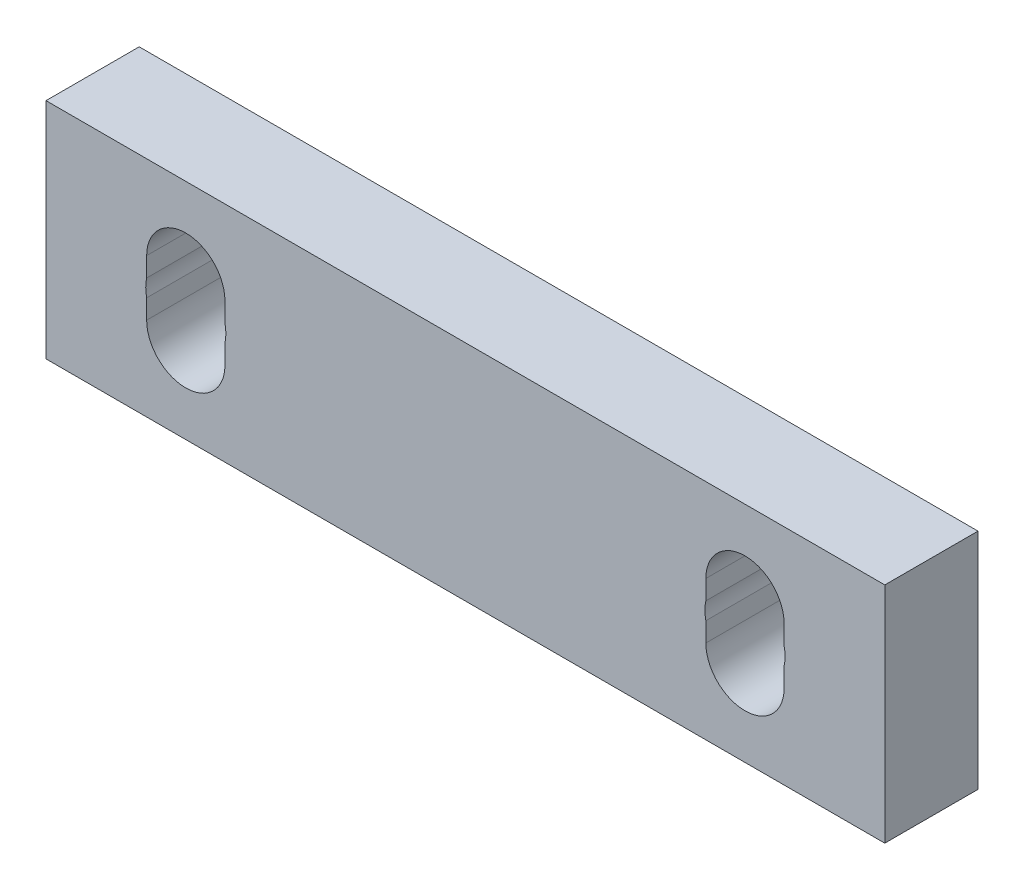
ISO-10303-21;
HEADER;
FILE_DESCRIPTION(('STEP AP214'),'2;1');
FILE_NAME('part.step','',(''),(''),'','','');
FILE_SCHEMA(('AUTOMOTIVE_DESIGN { 1 0 10303 214 1 1 1 1 }'));
ENDSEC;
DATA;
#1=APPLICATION_CONTEXT('core data for automotive mechanical design processes');
#2=APPLICATION_PROTOCOL_DEFINITION('international standard','automotive_design',2000,#1);
#3=PRODUCT_CONTEXT('',#1,'mechanical');
#4=PRODUCT('Part','Part','',(#3));
#5=PRODUCT_RELATED_PRODUCT_CATEGORY('part','',(#4));
#6=PRODUCT_DEFINITION_FORMATION('','',#4);
#7=PRODUCT_DEFINITION_CONTEXT('part definition',#1,'design');
#8=PRODUCT_DEFINITION('design','',#6,#7);
#9=PRODUCT_DEFINITION_SHAPE('','',#8);
#10=(LENGTH_UNIT() NAMED_UNIT(*) SI_UNIT(.MILLI.,.METRE.));
#11=(NAMED_UNIT(*) PLANE_ANGLE_UNIT() SI_UNIT($,.RADIAN.));
#12=(NAMED_UNIT(*) SI_UNIT($,.STERADIAN.) SOLID_ANGLE_UNIT());
#13=UNCERTAINTY_MEASURE_WITH_UNIT(LENGTH_MEASURE(1.E-05),#10,'distance_accuracy_value','');
#14=(GEOMETRIC_REPRESENTATION_CONTEXT(3) GLOBAL_UNCERTAINTY_ASSIGNED_CONTEXT((#13)) GLOBAL_UNIT_ASSIGNED_CONTEXT((#10,
#11,#12)) REPRESENTATION_CONTEXT('',''));
#15=CARTESIAN_POINT('',(0.,0.,0.));
#16=DIRECTION('',(0.,0.,1.));
#17=DIRECTION('',(1.,0.,0.));
#18=AXIS2_PLACEMENT_3D('',#15,#16,#17);
#19=CARTESIAN_POINT('',(15.,0.,5.));
#20=DIRECTION('',(0.,0.,-1.));
#21=DIRECTION('',(-1.,0.,0.));
#22=AXIS2_PLACEMENT_3D('',#19,#20,#21);
#23=CYLINDRICAL_SURFACE('',#22,2.15);
#24=DIRECTION('',(0.,0.,-1.));
#25=VECTOR('',#24,1.);
#26=CARTESIAN_POINT('',(12.9,0.460977222864625,5.));
#27=LINE('',#26,#25);
#28=CARTESIAN_POINT('',(12.9,0.460977222864625,5.));
#29=VERTEX_POINT('',#28);
#30=CARTESIAN_POINT('',(12.9,0.460977222864625,0.));
#31=VERTEX_POINT('',#30);
#32=EDGE_CURVE('E11',#29,#31,#27,.T.);
#33=ORIENTED_EDGE('',*,*,#32,.F.);
#34=CARTESIAN_POINT('',(15.,0.,5.));
#35=DIRECTION('',(0.,0.,1.));
#36=DIRECTION('',(1.,0.,0.));
#37=AXIS2_PLACEMENT_3D('',#34,#35,#36);
#38=CIRCLE('',#37,2.15);
#39=CARTESIAN_POINT('',(12.9,-0.460977222864632,5.));
#40=VERTEX_POINT('',#39);
#41=EDGE_CURVE('E253',#29,#40,#38,.T.);
#42=ORIENTED_EDGE('',*,*,#41,.T.);
#43=DIRECTION('',(0.,0.,-1.));
#44=VECTOR('',#43,1.);
#45=CARTESIAN_POINT('',(12.9,-0.460977222864632,5.));
#46=LINE('',#45,#44);
#47=CARTESIAN_POINT('',(12.9,-0.460977222864632,0.));
#48=VERTEX_POINT('',#47);
#49=EDGE_CURVE('E40',#48,#40,#46,.F.);
#50=ORIENTED_EDGE('',*,*,#49,.F.);
#51=CARTESIAN_POINT('',(15.,0.,0.));
#52=DIRECTION('',(0.,0.,1.));
#53=DIRECTION('',(1.,0.,0.));
#54=AXIS2_PLACEMENT_3D('',#51,#52,#53);
#55=CIRCLE('',#54,2.15);
#56=EDGE_CURVE('E254',#31,#48,#55,.T.);
#57=ORIENTED_EDGE('',*,*,#56,.F.);
#58=EDGE_LOOP('',(#33,#42,#50,#57));
#59=FACE_BOUND('',#58,.T.);
#60=ADVANCED_FACE('F32',(#59),#23,.F.);
#61=CARTESIAN_POINT('',(-15.,0.,5.));
#62=DIRECTION('',(0.,0.,-1.));
#63=DIRECTION('',(-1.,0.,0.));
#64=AXIS2_PLACEMENT_3D('',#61,#62,#63);
#65=CYLINDRICAL_SURFACE('',#64,2.15);
#66=DIRECTION('',(0.,0.,-1.));
#67=VECTOR('',#66,1.);
#68=CARTESIAN_POINT('',(-12.9,-0.460977222864656,5.));
#69=LINE('',#68,#67);
#70=CARTESIAN_POINT('',(-12.9,-0.460977222864651,5.));
#71=VERTEX_POINT('',#70);
#72=CARTESIAN_POINT('',(-12.9,-0.460977222864651,0.));
#73=VERTEX_POINT('',#72);
#74=EDGE_CURVE('E300',#71,#73,#69,.T.);
#75=ORIENTED_EDGE('',*,*,#74,.F.);
#76=CARTESIAN_POINT('',(-15.,0.,5.));
#77=DIRECTION('',(0.,0.,1.));
#78=DIRECTION('',(1.,0.,0.));
#79=AXIS2_PLACEMENT_3D('',#76,#77,#78);
#80=CIRCLE('',#79,2.15);
#81=CARTESIAN_POINT('',(-12.9,0.460977222864647,5.));
#82=VERTEX_POINT('',#81);
#83=EDGE_CURVE('E256',#71,#82,#80,.T.);
#84=ORIENTED_EDGE('',*,*,#83,.T.);
#85=DIRECTION('',(0.,0.,-1.));
#86=VECTOR('',#85,1.);
#87=CARTESIAN_POINT('',(-12.9,0.460977222864651,5.));
#88=LINE('',#87,#86);
#89=CARTESIAN_POINT('',(-12.9,0.460977222864647,0.));
#90=VERTEX_POINT('',#89);
#91=EDGE_CURVE('E298',#90,#82,#88,.F.);
#92=ORIENTED_EDGE('',*,*,#91,.F.);
#93=CARTESIAN_POINT('',(-15.,0.,0.));
#94=DIRECTION('',(0.,0.,1.));
#95=DIRECTION('',(1.,0.,0.));
#96=AXIS2_PLACEMENT_3D('',#93,#94,#95);
#97=CIRCLE('',#96,2.15);
#98=EDGE_CURVE('E261',#73,#90,#97,.T.);
#99=ORIENTED_EDGE('',*,*,#98,.F.);
#100=EDGE_LOOP('',(#75,#84,#92,#99));
#101=FACE_BOUND('',#100,.T.);
#102=ADVANCED_FACE('F341',(#101),#65,.F.);
#103=CARTESIAN_POINT('',(0.,0.,5.));
#104=DIRECTION('',(0.,0.,1.));
#105=DIRECTION('',(1.,0.,0.));
#106=AXIS2_PLACEMENT_3D('',#103,#104,#105);
#107=PLANE('',#106);
#108=DIRECTION('',(0.,-1.,0.));
#109=VECTOR('',#108,1.);
#110=CARTESIAN_POINT('',(12.9,-1.5,5.));
#111=LINE('',#110,#109);
#112=CARTESIAN_POINT('',(12.9,-1.5,5.));
#113=VERTEX_POINT('',#112);
#114=EDGE_CURVE('E194',#40,#113,#111,.T.);
#115=ORIENTED_EDGE('',*,*,#114,.F.);
#116=ORIENTED_EDGE('',*,*,#41,.F.);
#117=CARTESIAN_POINT('',(12.9,1.5,5.));
#118=VERTEX_POINT('',#117);
#119=EDGE_CURVE('E192',#118,#29,#111,.T.);
#120=ORIENTED_EDGE('',*,*,#119,.F.);
#121=CARTESIAN_POINT('',(15.,1.5,5.));
#122=DIRECTION('',(0.,0.,1.));
#123=DIRECTION('',(1.,0.,0.));
#124=AXIS2_PLACEMENT_3D('',#121,#122,#123);
#125=CIRCLE('',#124,2.1);
#126=CARTESIAN_POINT('',(17.1,1.5,5.));
#127=VERTEX_POINT('',#126);
#128=EDGE_CURVE('E204',#127,#118,#125,.T.);
#129=ORIENTED_EDGE('',*,*,#128,.F.);
#130=DIRECTION('',(0.,1.,0.));
#131=VECTOR('',#130,1.);
#132=CARTESIAN_POINT('',(17.1,-1.5,5.));
#133=LINE('',#132,#131);
#134=CARTESIAN_POINT('',(17.1,0.460977222864625,5.));
#135=VERTEX_POINT('',#134);
#136=EDGE_CURVE('E202',#135,#127,#133,.T.);
#137=ORIENTED_EDGE('',*,*,#136,.F.);
#138=CARTESIAN_POINT('',(17.1,-0.460977222864632,5.));
#139=VERTEX_POINT('',#138);
#140=EDGE_CURVE('E250',#139,#135,#38,.T.);
#141=ORIENTED_EDGE('',*,*,#140,.F.);
#142=CARTESIAN_POINT('',(17.1,-1.5,5.));
#143=VERTEX_POINT('',#142);
#144=EDGE_CURVE('E55',#143,#139,#133,.T.);
#145=ORIENTED_EDGE('',*,*,#144,.F.);
#146=CARTESIAN_POINT('',(15.,-1.5,5.));
#147=DIRECTION('',(0.,0.,1.));
#148=DIRECTION('',(1.,0.,0.));
#149=AXIS2_PLACEMENT_3D('',#146,#147,#148);
#150=CIRCLE('',#149,2.1);
#151=EDGE_CURVE('E176',#113,#143,#150,.T.);
#152=ORIENTED_EDGE('',*,*,#151,.F.);
#153=EDGE_LOOP('',(#115,#116,#120,#129,#137,#141,#145,#152));
#154=FACE_BOUND('',#153,.T.);
#155=DIRECTION('',(0.,1.,0.));
#156=VECTOR('',#155,1.);
#157=CARTESIAN_POINT('',(-12.9,1.5,5.));
#158=LINE('',#157,#156);
#159=CARTESIAN_POINT('',(-12.9,1.5,5.));
#160=VERTEX_POINT('',#159);
#161=EDGE_CURVE('E238',#82,#160,#158,.T.);
#162=ORIENTED_EDGE('',*,*,#161,.F.);
#163=ORIENTED_EDGE('',*,*,#83,.F.);
#164=CARTESIAN_POINT('',(-12.9,-1.5,5.));
#165=VERTEX_POINT('',#164);
#166=EDGE_CURVE('E218',#165,#71,#158,.T.);
#167=ORIENTED_EDGE('',*,*,#166,.F.);
#168=CARTESIAN_POINT('',(-15.,-1.5,5.));
#169=DIRECTION('',(0.,0.,1.));
#170=DIRECTION('',(1.,0.,0.));
#171=AXIS2_PLACEMENT_3D('',#168,#169,#170);
#172=CIRCLE('',#171,2.1);
#173=CARTESIAN_POINT('',(-17.1,-1.5,5.));
#174=VERTEX_POINT('',#173);
#175=EDGE_CURVE('E235',#174,#165,#172,.T.);
#176=ORIENTED_EDGE('',*,*,#175,.F.);
#177=DIRECTION('',(0.,-1.,0.));
#178=VECTOR('',#177,1.);
#179=CARTESIAN_POINT('',(-17.1,1.5,5.));
#180=LINE('',#179,#178);
#181=CARTESIAN_POINT('',(-17.1,-0.460977222864657,5.));
#182=VERTEX_POINT('',#181);
#183=EDGE_CURVE('E232',#182,#174,#180,.T.);
#184=ORIENTED_EDGE('',*,*,#183,.F.);
#185=CARTESIAN_POINT('',(-17.1,0.46097722286465,5.));
#186=VERTEX_POINT('',#185);
#187=EDGE_CURVE('E259',#186,#182,#80,.T.);
#188=ORIENTED_EDGE('',*,*,#187,.F.);
#189=CARTESIAN_POINT('',(-17.1,1.5,5.));
#190=VERTEX_POINT('',#189);
#191=EDGE_CURVE('E233',#190,#186,#180,.T.);
#192=ORIENTED_EDGE('',*,*,#191,.F.);
#193=CARTESIAN_POINT('',(-15.,1.5,5.));
#194=DIRECTION('',(0.,0.,1.));
#195=DIRECTION('',(1.,0.,0.));
#196=AXIS2_PLACEMENT_3D('',#193,#194,#195);
#197=CIRCLE('',#196,2.1);
#198=EDGE_CURVE('E209',#160,#190,#197,.T.);
#199=ORIENTED_EDGE('',*,*,#198,.F.);
#200=EDGE_LOOP('',(#162,#163,#167,#176,#184,#188,#192,#199));
#201=FACE_BOUND('',#200,.T.);
#202=DIRECTION('',(0.,-1.,0.));
#203=VECTOR('',#202,1.);
#204=CARTESIAN_POINT('',(-22.5,6.,5.));
#205=LINE('',#204,#203);
#206=CARTESIAN_POINT('',(-22.5,6.,5.));
#207=VERTEX_POINT('',#206);
#208=CARTESIAN_POINT('',(-22.5,-6.,5.));
#209=VERTEX_POINT('',#208);
#210=EDGE_CURVE('E264',#207,#209,#205,.T.);
#211=ORIENTED_EDGE('',*,*,#210,.T.);
#212=DIRECTION('',(1.,0.,0.));
#213=VECTOR('',#212,1.);
#214=CARTESIAN_POINT('',(-22.5,-6.,5.));
#215=LINE('',#214,#213);
#216=CARTESIAN_POINT('',(22.5,-6.,5.));
#217=VERTEX_POINT('',#216);
#218=EDGE_CURVE('E267',#209,#217,#215,.T.);
#219=ORIENTED_EDGE('',*,*,#218,.T.);
#220=DIRECTION('',(0.,1.,0.));
#221=VECTOR('',#220,1.);
#222=CARTESIAN_POINT('',(22.5,6.,5.));
#223=LINE('',#222,#221);
#224=CARTESIAN_POINT('',(22.5,6.,5.));
#225=VERTEX_POINT('',#224);
#226=EDGE_CURVE('E270',#217,#225,#223,.T.);
#227=ORIENTED_EDGE('',*,*,#226,.T.);
#228=DIRECTION('',(-1.,0.,0.));
#229=VECTOR('',#228,1.);
#230=CARTESIAN_POINT('',(-22.5,6.,5.));
#231=LINE('',#230,#229);
#232=EDGE_CURVE('E272',#225,#207,#231,.T.);
#233=ORIENTED_EDGE('',*,*,#232,.T.);
#234=EDGE_LOOP('',(#211,#219,#227,#233));
#235=FACE_BOUND('',#234,.T.);
#236=ADVANCED_FACE('F313',(#154,#201,#235),#107,.T.);
#237=CARTESIAN_POINT('',(0.,0.,0.));
#238=DIRECTION('',(0.,0.,1.));
#239=DIRECTION('',(1.,0.,0.));
#240=AXIS2_PLACEMENT_3D('',#237,#238,#239);
#241=PLANE('',#240);
#242=ORIENTED_EDGE('',*,*,#98,.T.);
#243=DIRECTION('',(0.,1.,0.));
#244=VECTOR('',#243,1.);
#245=CARTESIAN_POINT('',(-12.9,1.5,0.));
#246=LINE('',#245,#244);
#247=CARTESIAN_POINT('',(-12.9,1.5,0.));
#248=VERTEX_POINT('',#247);
#249=EDGE_CURVE('E225',#90,#248,#246,.T.);
#250=ORIENTED_EDGE('',*,*,#249,.T.);
#251=CARTESIAN_POINT('',(-15.,1.5,0.));
#252=DIRECTION('',(0.,0.,1.));
#253=DIRECTION('',(1.,0.,0.));
#254=AXIS2_PLACEMENT_3D('',#251,#252,#253);
#255=CIRCLE('',#254,2.1);
#256=CARTESIAN_POINT('',(-17.1,1.5,0.));
#257=VERTEX_POINT('',#256);
#258=EDGE_CURVE('E214',#248,#257,#255,.T.);
#259=ORIENTED_EDGE('',*,*,#258,.T.);
#260=DIRECTION('',(0.,-1.,0.));
#261=VECTOR('',#260,1.);
#262=CARTESIAN_POINT('',(-17.1,1.5,0.));
#263=LINE('',#262,#261);
#264=CARTESIAN_POINT('',(-17.1,0.46097722286465,0.));
#265=VERTEX_POINT('',#264);
#266=EDGE_CURVE('E219',#257,#265,#263,.T.);
#267=ORIENTED_EDGE('',*,*,#266,.T.);
#268=CARTESIAN_POINT('',(-17.1,-0.460977222864657,0.));
#269=VERTEX_POINT('',#268);
#270=EDGE_CURVE('E260',#265,#269,#97,.T.);
#271=ORIENTED_EDGE('',*,*,#270,.T.);
#272=CARTESIAN_POINT('',(-17.1,-1.5,0.));
#273=VERTEX_POINT('',#272);
#274=EDGE_CURVE('E217',#269,#273,#263,.T.);
#275=ORIENTED_EDGE('',*,*,#274,.T.);
#276=CARTESIAN_POINT('',(-15.,-1.5,0.));
#277=DIRECTION('',(0.,0.,1.));
#278=DIRECTION('',(1.,0.,0.));
#279=AXIS2_PLACEMENT_3D('',#276,#277,#278);
#280=CIRCLE('',#279,2.1);
#281=CARTESIAN_POINT('',(-12.9,-1.5,0.));
#282=VERTEX_POINT('',#281);
#283=EDGE_CURVE('E222',#273,#282,#280,.T.);
#284=ORIENTED_EDGE('',*,*,#283,.T.);
#285=EDGE_CURVE('E226',#282,#73,#246,.T.);
#286=ORIENTED_EDGE('',*,*,#285,.T.);
#287=EDGE_LOOP('',(#242,#250,#259,#267,#271,#275,#284,#286));
#288=FACE_BOUND('',#287,.T.);
#289=DIRECTION('',(0.,-1.,0.));
#290=VECTOR('',#289,1.);
#291=CARTESIAN_POINT('',(-22.5,6.,0.));
#292=LINE('',#291,#290);
#293=CARTESIAN_POINT('',(-22.5,6.,0.));
#294=VERTEX_POINT('',#293);
#295=CARTESIAN_POINT('',(-22.5,-6.,0.));
#296=VERTEX_POINT('',#295);
#297=EDGE_CURVE('E275',#294,#296,#292,.T.);
#298=ORIENTED_EDGE('',*,*,#297,.F.);
#299=DIRECTION('',(-1.,0.,0.));
#300=VECTOR('',#299,1.);
#301=CARTESIAN_POINT('',(-22.5,6.,0.));
#302=LINE('',#301,#300);
#303=CARTESIAN_POINT('',(22.5,6.,0.));
#304=VERTEX_POINT('',#303);
#305=EDGE_CURVE('E268',#304,#294,#302,.T.);
#306=ORIENTED_EDGE('',*,*,#305,.F.);
#307=DIRECTION('',(0.,1.,0.));
#308=VECTOR('',#307,1.);
#309=CARTESIAN_POINT('',(22.5,6.,0.));
#310=LINE('',#309,#308);
#311=CARTESIAN_POINT('',(22.5,-6.,0.));
#312=VERTEX_POINT('',#311);
#313=EDGE_CURVE('E280',#312,#304,#310,.T.);
#314=ORIENTED_EDGE('',*,*,#313,.F.);
#315=DIRECTION('',(1.,0.,0.));
#316=VECTOR('',#315,1.);
#317=CARTESIAN_POINT('',(-22.5,-6.,0.));
#318=LINE('',#317,#316);
#319=EDGE_CURVE('E278',#296,#312,#318,.T.);
#320=ORIENTED_EDGE('',*,*,#319,.F.);
#321=EDGE_LOOP('',(#298,#306,#314,#320));
#322=FACE_BOUND('',#321,.T.);
#323=ORIENTED_EDGE('',*,*,#56,.T.);
#324=DIRECTION('',(0.,-1.,0.));
#325=VECTOR('',#324,1.);
#326=CARTESIAN_POINT('',(12.9,-1.5,0.));
#327=LINE('',#326,#325);
#328=CARTESIAN_POINT('',(12.9,-1.5,0.));
#329=VERTEX_POINT('',#328);
#330=EDGE_CURVE('E191',#48,#329,#327,.T.);
#331=ORIENTED_EDGE('',*,*,#330,.T.);
#332=CARTESIAN_POINT('',(15.,-1.5,0.));
#333=DIRECTION('',(0.,0.,1.));
#334=DIRECTION('',(1.,0.,0.));
#335=AXIS2_PLACEMENT_3D('',#332,#333,#334);
#336=CIRCLE('',#335,2.1);
#337=CARTESIAN_POINT('',(17.1,-1.5,0.));
#338=VERTEX_POINT('',#337);
#339=EDGE_CURVE('E173',#329,#338,#336,.T.);
#340=ORIENTED_EDGE('',*,*,#339,.T.);
#341=DIRECTION('',(0.,1.,0.));
#342=VECTOR('',#341,1.);
#343=CARTESIAN_POINT('',(17.1,-1.5,0.));
#344=LINE('',#343,#342);
#345=CARTESIAN_POINT('',(17.1,-0.460977222864632,0.));
#346=VERTEX_POINT('',#345);
#347=EDGE_CURVE('E181',#338,#346,#344,.T.);
#348=ORIENTED_EDGE('',*,*,#347,.T.);
#349=CARTESIAN_POINT('',(17.1,0.460977222864625,0.));
#350=VERTEX_POINT('',#349);
#351=EDGE_CURVE('E243',#346,#350,#55,.T.);
#352=ORIENTED_EDGE('',*,*,#351,.T.);
#353=CARTESIAN_POINT('',(17.1,1.5,0.));
#354=VERTEX_POINT('',#353);
#355=EDGE_CURVE('E47',#350,#354,#344,.T.);
#356=ORIENTED_EDGE('',*,*,#355,.T.);
#357=CARTESIAN_POINT('',(15.,1.5,0.));
#358=DIRECTION('',(0.,0.,1.));
#359=DIRECTION('',(1.,0.,0.));
#360=AXIS2_PLACEMENT_3D('',#357,#358,#359);
#361=CIRCLE('',#360,2.1);
#362=CARTESIAN_POINT('',(12.9,1.5,0.));
#363=VERTEX_POINT('',#362);
#364=EDGE_CURVE('E187',#354,#363,#361,.T.);
#365=ORIENTED_EDGE('',*,*,#364,.T.);
#366=EDGE_CURVE('E178',#363,#31,#327,.T.);
#367=ORIENTED_EDGE('',*,*,#366,.T.);
#368=EDGE_LOOP('',(#323,#331,#340,#348,#352,#356,#365,#367));
#369=FACE_BOUND('',#368,.T.);
#370=ADVANCED_FACE('F190',(#288,#322,#369),#241,.F.);
#371=CARTESIAN_POINT('',(-22.5,6.,5.));
#372=DIRECTION('',(1.,0.,0.));
#373=DIRECTION('',(0.,1.,0.));
#374=AXIS2_PLACEMENT_3D('',#371,#372,#373);
#375=PLANE('',#374);
#376=ORIENTED_EDGE('',*,*,#297,.T.);
#377=DIRECTION('',(0.,0.,-1.));
#378=VECTOR('',#377,1.);
#379=CARTESIAN_POINT('',(-22.5,-6.,5.));
#380=LINE('',#379,#378);
#381=EDGE_CURVE('E291',#209,#296,#380,.T.);
#382=ORIENTED_EDGE('',*,*,#381,.F.);
#383=ORIENTED_EDGE('',*,*,#210,.F.);
#384=DIRECTION('',(0.,0.,-1.));
#385=VECTOR('',#384,1.);
#386=CARTESIAN_POINT('',(-22.5,6.,5.));
#387=LINE('',#386,#385);
#388=EDGE_CURVE('E274',#207,#294,#387,.T.);
#389=ORIENTED_EDGE('',*,*,#388,.T.);
#390=EDGE_LOOP('',(#376,#382,#383,#389));
#391=FACE_BOUND('',#390,.T.);
#392=ADVANCED_FACE('F34',(#391),#375,.F.);
#393=CARTESIAN_POINT('',(-22.5,-6.,5.));
#394=DIRECTION('',(0.,1.,0.));
#395=DIRECTION('',(0.,0.,1.));
#396=AXIS2_PLACEMENT_3D('',#393,#394,#395);
#397=PLANE('',#396);
#398=ORIENTED_EDGE('',*,*,#319,.T.);
#399=DIRECTION('',(0.,0.,-1.));
#400=VECTOR('',#399,1.);
#401=CARTESIAN_POINT('',(22.5,-6.,5.));
#402=LINE('',#401,#400);
#403=EDGE_CURVE('E288',#217,#312,#402,.T.);
#404=ORIENTED_EDGE('',*,*,#403,.F.);
#405=ORIENTED_EDGE('',*,*,#218,.F.);
#406=ORIENTED_EDGE('',*,*,#381,.T.);
#407=EDGE_LOOP('',(#398,#404,#405,#406));
#408=FACE_BOUND('',#407,.T.);
#409=ADVANCED_FACE('F375',(#408),#397,.F.);
#410=CARTESIAN_POINT('',(22.5,6.,5.));
#411=DIRECTION('',(-1.,0.,0.));
#412=DIRECTION('',(0.,-1.,0.));
#413=AXIS2_PLACEMENT_3D('',#410,#411,#412);
#414=PLANE('',#413);
#415=ORIENTED_EDGE('',*,*,#313,.T.);
#416=DIRECTION('',(0.,0.,-1.));
#417=VECTOR('',#416,1.);
#418=CARTESIAN_POINT('',(22.5,6.,5.));
#419=LINE('',#418,#417);
#420=EDGE_CURVE('E285',#225,#304,#419,.T.);
#421=ORIENTED_EDGE('',*,*,#420,.F.);
#422=ORIENTED_EDGE('',*,*,#226,.F.);
#423=ORIENTED_EDGE('',*,*,#403,.T.);
#424=EDGE_LOOP('',(#415,#421,#422,#423));
#425=FACE_BOUND('',#424,.T.);
#426=ADVANCED_FACE('F364',(#425),#414,.F.);
#427=CARTESIAN_POINT('',(-22.5,6.,5.));
#428=DIRECTION('',(0.,-1.,0.));
#429=DIRECTION('',(1.,0.,0.));
#430=AXIS2_PLACEMENT_3D('',#427,#428,#429);
#431=PLANE('',#430);
#432=ORIENTED_EDGE('',*,*,#305,.T.);
#433=ORIENTED_EDGE('',*,*,#388,.F.);
#434=ORIENTED_EDGE('',*,*,#232,.F.);
#435=ORIENTED_EDGE('',*,*,#420,.T.);
#436=EDGE_LOOP('',(#432,#433,#434,#435));
#437=FACE_BOUND('',#436,.T.);
#438=ADVANCED_FACE('F359',(#437),#431,.F.);
#439=DIRECTION('',(0.,0.,-1.));
#440=VECTOR('',#439,1.);
#441=CARTESIAN_POINT('',(-17.1,0.46097722286465,5.));
#442=LINE('',#441,#440);
#443=EDGE_CURVE('E296',#186,#265,#442,.T.);
#444=ORIENTED_EDGE('',*,*,#443,.F.);
#445=ORIENTED_EDGE('',*,*,#187,.T.);
#446=DIRECTION('',(0.,0.,-1.));
#447=VECTOR('',#446,1.);
#448=CARTESIAN_POINT('',(-17.1,-0.460977222864657,5.));
#449=LINE('',#448,#447);
#450=EDGE_CURVE('E294',#269,#182,#449,.F.);
#451=ORIENTED_EDGE('',*,*,#450,.F.);
#452=ORIENTED_EDGE('',*,*,#270,.F.);
#453=EDGE_LOOP('',(#444,#445,#451,#452));
#454=FACE_BOUND('',#453,.T.);
#455=ADVANCED_FACE('F348',(#454),#65,.F.);
#456=DIRECTION('',(0.,0.,-1.));
#457=VECTOR('',#456,1.);
#458=CARTESIAN_POINT('',(17.1,-0.460977222864632,5.));
#459=LINE('',#458,#457);
#460=EDGE_CURVE('E183',#139,#346,#459,.T.);
#461=ORIENTED_EDGE('',*,*,#460,.F.);
#462=ORIENTED_EDGE('',*,*,#140,.T.);
#463=DIRECTION('',(0.,0.,-1.));
#464=VECTOR('',#463,1.);
#465=CARTESIAN_POINT('',(17.1,0.460977222864625,5.));
#466=LINE('',#465,#464);
#467=EDGE_CURVE('E302',#350,#135,#466,.F.);
#468=ORIENTED_EDGE('',*,*,#467,.F.);
#469=ORIENTED_EDGE('',*,*,#351,.F.);
#470=EDGE_LOOP('',(#461,#462,#468,#469));
#471=FACE_BOUND('',#470,.T.);
#472=ADVANCED_FACE('F327',(#471),#23,.F.);
#473=CARTESIAN_POINT('',(-12.9,1.5,0.));
#474=DIRECTION('',(1.,0.,0.));
#475=DIRECTION('',(0.,1.,0.));
#476=AXIS2_PLACEMENT_3D('',#473,#474,#475);
#477=PLANE('',#476);
#478=ORIENTED_EDGE('',*,*,#74,.T.);
#479=ORIENTED_EDGE('',*,*,#285,.F.);
#480=DIRECTION('',(0.,0.,1.));
#481=VECTOR('',#480,1.);
#482=CARTESIAN_POINT('',(-12.9,-1.5,0.));
#483=LINE('',#482,#481);
#484=EDGE_CURVE('E244',#282,#165,#483,.T.);
#485=ORIENTED_EDGE('',*,*,#484,.T.);
#486=ORIENTED_EDGE('',*,*,#166,.T.);
#487=EDGE_LOOP('',(#478,#479,#485,#486));
#488=FACE_BOUND('',#487,.T.);
#489=ADVANCED_FACE('F351',(#488),#477,.F.);
#490=CARTESIAN_POINT('',(-17.1,1.5,0.));
#491=DIRECTION('',(-1.,0.,0.));
#492=DIRECTION('',(0.,0.,1.));
#493=AXIS2_PLACEMENT_3D('',#490,#491,#492);
#494=PLANE('',#493);
#495=ORIENTED_EDGE('',*,*,#450,.T.);
#496=ORIENTED_EDGE('',*,*,#183,.T.);
#497=DIRECTION('',(0.,0.,1.));
#498=VECTOR('',#497,1.);
#499=CARTESIAN_POINT('',(-17.1,-1.5,0.));
#500=LINE('',#499,#498);
#501=EDGE_CURVE('E246',#273,#174,#500,.T.);
#502=ORIENTED_EDGE('',*,*,#501,.F.);
#503=ORIENTED_EDGE('',*,*,#274,.F.);
#504=EDGE_LOOP('',(#495,#496,#502,#503));
#505=FACE_BOUND('',#504,.T.);
#506=ADVANCED_FACE('F356',(#505),#494,.F.);
#507=CARTESIAN_POINT('',(-15.,-1.5,0.));
#508=DIRECTION('',(0.,0.,1.));
#509=DIRECTION('',(1.,0.,0.));
#510=AXIS2_PLACEMENT_3D('',#507,#508,#509);
#511=CYLINDRICAL_SURFACE('',#510,2.1);
#512=ORIENTED_EDGE('',*,*,#175,.T.);
#513=ORIENTED_EDGE('',*,*,#484,.F.);
#514=ORIENTED_EDGE('',*,*,#283,.F.);
#515=ORIENTED_EDGE('',*,*,#501,.T.);
#516=EDGE_LOOP('',(#512,#513,#514,#515));
#517=FACE_BOUND('',#516,.T.);
#518=ADVANCED_FACE('F458',(#517),#511,.F.);
#519=ORIENTED_EDGE('',*,*,#443,.T.);
#520=ORIENTED_EDGE('',*,*,#266,.F.);
#521=DIRECTION('',(0.,0.,1.));
#522=VECTOR('',#521,1.);
#523=CARTESIAN_POINT('',(-17.1,1.5,0.));
#524=LINE('',#523,#522);
#525=EDGE_CURVE('E229',#257,#190,#524,.T.);
#526=ORIENTED_EDGE('',*,*,#525,.T.);
#527=ORIENTED_EDGE('',*,*,#191,.T.);
#528=EDGE_LOOP('',(#519,#520,#526,#527));
#529=FACE_BOUND('',#528,.T.);
#530=ADVANCED_FACE('F461',(#529),#494,.F.);
#531=CARTESIAN_POINT('',(-15.,1.5,0.));
#532=DIRECTION('',(0.,0.,1.));
#533=DIRECTION('',(1.,0.,0.));
#534=AXIS2_PLACEMENT_3D('',#531,#532,#533);
#535=CYLINDRICAL_SURFACE('',#534,2.1);
#536=ORIENTED_EDGE('',*,*,#198,.T.);
#537=ORIENTED_EDGE('',*,*,#525,.F.);
#538=ORIENTED_EDGE('',*,*,#258,.F.);
#539=DIRECTION('',(0.,0.,1.));
#540=VECTOR('',#539,1.);
#541=CARTESIAN_POINT('',(-12.9,1.5,0.));
#542=LINE('',#541,#540);
#543=EDGE_CURVE('E240',#248,#160,#542,.T.);
#544=ORIENTED_EDGE('',*,*,#543,.T.);
#545=EDGE_LOOP('',(#536,#537,#538,#544));
#546=FACE_BOUND('',#545,.T.);
#547=ADVANCED_FACE('F478',(#546),#535,.F.);
#548=ORIENTED_EDGE('',*,*,#91,.T.);
#549=ORIENTED_EDGE('',*,*,#161,.T.);
#550=ORIENTED_EDGE('',*,*,#543,.F.);
#551=ORIENTED_EDGE('',*,*,#249,.F.);
#552=EDGE_LOOP('',(#548,#549,#550,#551));
#553=FACE_BOUND('',#552,.T.);
#554=ADVANCED_FACE('F336',(#553),#477,.F.);
#555=CARTESIAN_POINT('',(12.9,-1.5,0.));
#556=DIRECTION('',(-1.,0.,0.));
#557=DIRECTION('',(0.,0.,1.));
#558=AXIS2_PLACEMENT_3D('',#555,#556,#557);
#559=PLANE('',#558);
#560=ORIENTED_EDGE('',*,*,#32,.T.);
#561=ORIENTED_EDGE('',*,*,#366,.F.);
#562=DIRECTION('',(0.,0.,1.));
#563=VECTOR('',#562,1.);
#564=CARTESIAN_POINT('',(12.9,1.5,0.));
#565=LINE('',#564,#563);
#566=EDGE_CURVE('E210',#363,#118,#565,.T.);
#567=ORIENTED_EDGE('',*,*,#566,.T.);
#568=ORIENTED_EDGE('',*,*,#119,.T.);
#569=EDGE_LOOP('',(#560,#561,#567,#568));
#570=FACE_BOUND('',#569,.T.);
#571=ADVANCED_FACE('F319',(#570),#559,.F.);
#572=CARTESIAN_POINT('',(17.1,-1.5,0.));
#573=DIRECTION('',(1.,0.,0.));
#574=DIRECTION('',(0.,0.,-1.));
#575=AXIS2_PLACEMENT_3D('',#572,#573,#574);
#576=PLANE('',#575);
#577=ORIENTED_EDGE('',*,*,#467,.T.);
#578=ORIENTED_EDGE('',*,*,#136,.T.);
#579=DIRECTION('',(0.,0.,1.));
#580=VECTOR('',#579,1.);
#581=CARTESIAN_POINT('',(17.1,1.5,0.));
#582=LINE('',#581,#580);
#583=EDGE_CURVE('E177',#354,#127,#582,.T.);
#584=ORIENTED_EDGE('',*,*,#583,.F.);
#585=ORIENTED_EDGE('',*,*,#355,.F.);
#586=EDGE_LOOP('',(#577,#578,#584,#585));
#587=FACE_BOUND('',#586,.T.);
#588=ADVANCED_FACE('F328',(#587),#576,.F.);
#589=CARTESIAN_POINT('',(15.,1.5,0.));
#590=DIRECTION('',(0.,0.,1.));
#591=DIRECTION('',(1.,0.,0.));
#592=AXIS2_PLACEMENT_3D('',#589,#590,#591);
#593=CYLINDRICAL_SURFACE('',#592,2.1);
#594=ORIENTED_EDGE('',*,*,#128,.T.);
#595=ORIENTED_EDGE('',*,*,#566,.F.);
#596=ORIENTED_EDGE('',*,*,#364,.F.);
#597=ORIENTED_EDGE('',*,*,#583,.T.);
#598=EDGE_LOOP('',(#594,#595,#596,#597));
#599=FACE_BOUND('',#598,.T.);
#600=ADVANCED_FACE('F322',(#599),#593,.F.);
#601=ORIENTED_EDGE('',*,*,#460,.T.);
#602=ORIENTED_EDGE('',*,*,#347,.F.);
#603=DIRECTION('',(0.,0.,1.));
#604=VECTOR('',#603,1.);
#605=CARTESIAN_POINT('',(17.1,-1.5,0.));
#606=LINE('',#605,#604);
#607=EDGE_CURVE('E168',#338,#143,#606,.T.);
#608=ORIENTED_EDGE('',*,*,#607,.T.);
#609=ORIENTED_EDGE('',*,*,#144,.T.);
#610=EDGE_LOOP('',(#601,#602,#608,#609));
#611=FACE_BOUND('',#610,.T.);
#612=ADVANCED_FACE('F182',(#611),#576,.F.);
#613=CARTESIAN_POINT('',(15.,-1.5,0.));
#614=DIRECTION('',(0.,0.,1.));
#615=DIRECTION('',(1.,0.,0.));
#616=AXIS2_PLACEMENT_3D('',#613,#614,#615);
#617=CYLINDRICAL_SURFACE('',#616,2.1);
#618=ORIENTED_EDGE('',*,*,#151,.T.);
#619=ORIENTED_EDGE('',*,*,#607,.F.);
#620=ORIENTED_EDGE('',*,*,#339,.F.);
#621=DIRECTION('',(0.,0.,1.));
#622=VECTOR('',#621,1.);
#623=CARTESIAN_POINT('',(12.9,-1.5,0.));
#624=LINE('',#623,#622);
#625=EDGE_CURVE('E207',#329,#113,#624,.T.);
#626=ORIENTED_EDGE('',*,*,#625,.T.);
#627=EDGE_LOOP('',(#618,#619,#620,#626));
#628=FACE_BOUND('',#627,.T.);
#629=ADVANCED_FACE('F170',(#628),#617,.F.);
#630=ORIENTED_EDGE('',*,*,#49,.T.);
#631=ORIENTED_EDGE('',*,*,#114,.T.);
#632=ORIENTED_EDGE('',*,*,#625,.F.);
#633=ORIENTED_EDGE('',*,*,#330,.F.);
#634=EDGE_LOOP('',(#630,#631,#632,#633));
#635=FACE_BOUND('',#634,.T.);
#636=ADVANCED_FACE('F307',(#635),#559,.F.);
#637=CLOSED_SHELL('',(#60,#102,#236,#370,#392,#409,#426,#438,#455,#472,#489,#506,#518,#530,#547,
#554,#571,#588,#600,#612,#629,#636));
#638=MANIFOLD_SOLID_BREP('B2',#637);
#639=ADVANCED_BREP_SHAPE_REPRESENTATION('',(#18,#638),#14);
#640=SHAPE_DEFINITION_REPRESENTATION(#9,#639);
ENDSEC;
END-ISO-10303-21;
